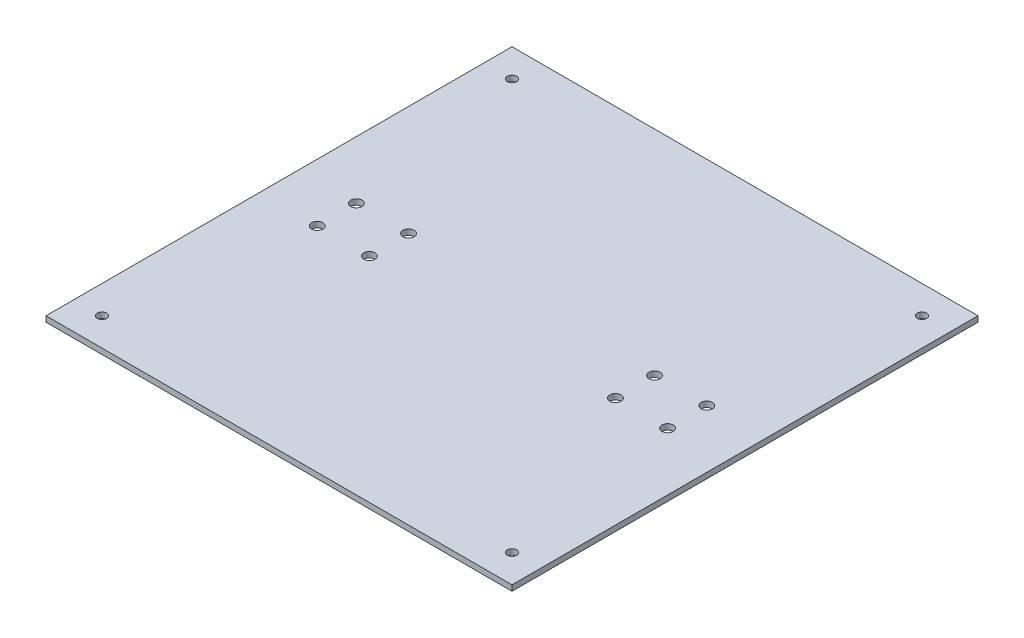
ISO-10303-21;
HEADER;
FILE_DESCRIPTION(('STEP AP214'),'2;1');
FILE_NAME('part.step','',(''),(''),'','','');
FILE_SCHEMA(('AUTOMOTIVE_DESIGN { 1 0 10303 214 1 1 1 1 }'));
ENDSEC;
DATA;
#1=APPLICATION_CONTEXT('core data for automotive mechanical design processes');
#2=APPLICATION_PROTOCOL_DEFINITION('international standard','automotive_design',2000,#1);
#3=PRODUCT_CONTEXT('',#1,'mechanical');
#4=PRODUCT('Part','Part','',(#3));
#5=PRODUCT_RELATED_PRODUCT_CATEGORY('part','',(#4));
#6=PRODUCT_DEFINITION_FORMATION('','',#4);
#7=PRODUCT_DEFINITION_CONTEXT('part definition',#1,'design');
#8=PRODUCT_DEFINITION('design','',#6,#7);
#9=PRODUCT_DEFINITION_SHAPE('','',#8);
#10=(LENGTH_UNIT() NAMED_UNIT(*) SI_UNIT(.MILLI.,.METRE.));
#11=(NAMED_UNIT(*) PLANE_ANGLE_UNIT() SI_UNIT($,.RADIAN.));
#12=(NAMED_UNIT(*) SI_UNIT($,.STERADIAN.) SOLID_ANGLE_UNIT());
#13=UNCERTAINTY_MEASURE_WITH_UNIT(LENGTH_MEASURE(1.E-05),#10,'distance_accuracy_value','');
#14=(GEOMETRIC_REPRESENTATION_CONTEXT(3) GLOBAL_UNCERTAINTY_ASSIGNED_CONTEXT((#13)) GLOBAL_UNIT_ASSIGNED_CONTEXT((#10,
#11,#12)) REPRESENTATION_CONTEXT('',''));
#15=CARTESIAN_POINT('',(0.,0.,0.));
#16=DIRECTION('',(0.,0.,1.));
#17=DIRECTION('',(1.,0.,0.));
#18=AXIS2_PLACEMENT_3D('',#15,#16,#17);
#19=CARTESIAN_POINT('',(0.,3.,0.));
#20=DIRECTION('',(1.,0.,0.));
#21=DIRECTION('',(0.,0.,-1.));
#22=AXIS2_PLACEMENT_3D('',#19,#20,#21);
#23=PLANE('',#22);
#24=DIRECTION('',(0.,0.,1.));
#25=VECTOR('',#24,1.);
#26=CARTESIAN_POINT('',(0.,0.,0.));
#27=LINE('',#26,#25);
#28=CARTESIAN_POINT('',(0.,0.,-250.));
#29=VERTEX_POINT('',#28);
#30=CARTESIAN_POINT('',(0.,0.,0.));
#31=VERTEX_POINT('',#30);
#32=EDGE_CURVE('E96',#29,#31,#27,.T.);
#33=ORIENTED_EDGE('',*,*,#32,.T.);
#34=DIRECTION('',(0.,-1.,0.));
#35=VECTOR('',#34,1.);
#36=CARTESIAN_POINT('',(0.,3.,0.));
#37=LINE('',#36,#35);
#38=CARTESIAN_POINT('',(0.,3.,0.));
#39=VERTEX_POINT('',#38);
#40=EDGE_CURVE('E11',#39,#31,#37,.T.);
#41=ORIENTED_EDGE('',*,*,#40,.F.);
#42=DIRECTION('',(0.,0.,1.));
#43=VECTOR('',#42,1.);
#44=CARTESIAN_POINT('',(0.,3.,0.));
#45=LINE('',#44,#43);
#46=CARTESIAN_POINT('',(0.,3.,-250.));
#47=VERTEX_POINT('',#46);
#48=EDGE_CURVE('E84',#47,#39,#45,.T.);
#49=ORIENTED_EDGE('',*,*,#48,.F.);
#50=DIRECTION('',(0.,-1.,0.));
#51=VECTOR('',#50,1.);
#52=CARTESIAN_POINT('',(0.,3.,-250.));
#53=LINE('',#52,#51);
#54=EDGE_CURVE('E92',#47,#29,#53,.T.);
#55=ORIENTED_EDGE('',*,*,#54,.T.);
#56=EDGE_LOOP('',(#33,#41,#49,#55));
#57=FACE_BOUND('',#56,.T.);
#58=ADVANCED_FACE('F33',(#57),#23,.F.);
#59=CARTESIAN_POINT('',(0.,3.,0.));
#60=DIRECTION('',(0.,0.,-1.));
#61=DIRECTION('',(-1.,0.,0.));
#62=AXIS2_PLACEMENT_3D('',#59,#60,#61);
#63=PLANE('',#62);
#64=DIRECTION('',(1.,0.,0.));
#65=VECTOR('',#64,1.);
#66=CARTESIAN_POINT('',(0.,0.,0.));
#67=LINE('',#66,#65);
#68=CARTESIAN_POINT('',(250.,0.,0.));
#69=VERTEX_POINT('',#68);
#70=EDGE_CURVE('E88',#31,#69,#67,.T.);
#71=ORIENTED_EDGE('',*,*,#70,.T.);
#72=DIRECTION('',(0.,-1.,0.));
#73=VECTOR('',#72,1.);
#74=CARTESIAN_POINT('',(250.,3.,0.));
#75=LINE('',#74,#73);
#76=CARTESIAN_POINT('',(250.,3.,0.));
#77=VERTEX_POINT('',#76);
#78=EDGE_CURVE('E41',#77,#69,#75,.T.);
#79=ORIENTED_EDGE('',*,*,#78,.F.);
#80=DIRECTION('',(1.,0.,0.));
#81=VECTOR('',#80,1.);
#82=CARTESIAN_POINT('',(0.,3.,0.));
#83=LINE('',#82,#81);
#84=EDGE_CURVE('E79',#39,#77,#83,.T.);
#85=ORIENTED_EDGE('',*,*,#84,.F.);
#86=ORIENTED_EDGE('',*,*,#40,.T.);
#87=EDGE_LOOP('',(#71,#79,#85,#86));
#88=FACE_BOUND('',#87,.T.);
#89=ADVANCED_FACE('F87',(#88),#63,.F.);
#90=CARTESIAN_POINT('',(250.,3.,0.));
#91=DIRECTION('',(-1.,0.,0.));
#92=DIRECTION('',(0.,0.,1.));
#93=AXIS2_PLACEMENT_3D('',#90,#91,#92);
#94=PLANE('',#93);
#95=DIRECTION('',(0.,0.,-1.));
#96=VECTOR('',#95,1.);
#97=CARTESIAN_POINT('',(250.,0.,0.));
#98=LINE('',#97,#96);
#99=CARTESIAN_POINT('',(250.,0.,-250.));
#100=VERTEX_POINT('',#99);
#101=EDGE_CURVE('E66',#69,#100,#98,.T.);
#102=ORIENTED_EDGE('',*,*,#101,.T.);
#103=DIRECTION('',(0.,-1.,0.));
#104=VECTOR('',#103,1.);
#105=CARTESIAN_POINT('',(250.,3.,-250.));
#106=LINE('',#105,#104);
#107=CARTESIAN_POINT('',(250.,3.,-250.));
#108=VERTEX_POINT('',#107);
#109=EDGE_CURVE('E89',#108,#100,#106,.T.);
#110=ORIENTED_EDGE('',*,*,#109,.F.);
#111=DIRECTION('',(0.,0.,-1.));
#112=VECTOR('',#111,1.);
#113=CARTESIAN_POINT('',(250.,3.,0.));
#114=LINE('',#113,#112);
#115=EDGE_CURVE('E82',#77,#108,#114,.T.);
#116=ORIENTED_EDGE('',*,*,#115,.F.);
#117=ORIENTED_EDGE('',*,*,#78,.T.);
#118=EDGE_LOOP('',(#102,#110,#116,#117));
#119=FACE_BOUND('',#118,.T.);
#120=ADVANCED_FACE('F90',(#119),#94,.F.);
#121=CARTESIAN_POINT('',(0.,3.,-250.));
#122=DIRECTION('',(0.,0.,1.));
#123=DIRECTION('',(1.,0.,0.));
#124=AXIS2_PLACEMENT_3D('',#121,#122,#123);
#125=PLANE('',#124);
#126=DIRECTION('',(-1.,0.,0.));
#127=VECTOR('',#126,1.);
#128=CARTESIAN_POINT('',(0.,0.,-250.));
#129=LINE('',#128,#127);
#130=EDGE_CURVE('E72',#100,#29,#129,.T.);
#131=ORIENTED_EDGE('',*,*,#130,.T.);
#132=ORIENTED_EDGE('',*,*,#54,.F.);
#133=DIRECTION('',(-1.,0.,0.));
#134=VECTOR('',#133,1.);
#135=CARTESIAN_POINT('',(0.,3.,-250.));
#136=LINE('',#135,#134);
#137=EDGE_CURVE('E49',#108,#47,#136,.T.);
#138=ORIENTED_EDGE('',*,*,#137,.F.);
#139=ORIENTED_EDGE('',*,*,#109,.T.);
#140=EDGE_LOOP('',(#131,#132,#138,#139));
#141=FACE_BOUND('',#140,.T.);
#142=ADVANCED_FACE('F104',(#141),#125,.F.);
#143=CARTESIAN_POINT('',(0.,3.,0.));
#144=DIRECTION('',(0.,-1.,0.));
#145=DIRECTION('',(0.,0.,-1.));
#146=AXIS2_PLACEMENT_3D('',#143,#144,#145);
#147=PLANE('',#146);
#148=CARTESIAN_POINT('',(191.,3.,-114.5));
#149=DIRECTION('',(0.,1.,0.));
#150=DIRECTION('',(0.,0.,1.));
#151=AXIS2_PLACEMENT_3D('',#148,#149,#150);
#152=CIRCLE('',#151,2.99999999999999);
#153=CARTESIAN_POINT('',(191.,3.,-111.5));
#154=VERTEX_POINT('',#153);
#155=EDGE_CURVE('E176',#154,#154,#152,.T.);
#156=ORIENTED_EDGE('',*,*,#155,.F.);
#157=EDGE_LOOP('',(#156));
#158=FACE_BOUND('',#157,.T.);
#159=CARTESIAN_POINT('',(219.,3.,-114.5));
#160=DIRECTION('',(0.,1.,0.));
#161=DIRECTION('',(0.,0.,1.));
#162=AXIS2_PLACEMENT_3D('',#159,#160,#161);
#163=CIRCLE('',#162,2.99999999999999);
#164=CARTESIAN_POINT('',(219.,3.,-111.5));
#165=VERTEX_POINT('',#164);
#166=EDGE_CURVE('E170',#165,#165,#163,.T.);
#167=ORIENTED_EDGE('',*,*,#166,.F.);
#168=EDGE_LOOP('',(#167));
#169=FACE_BOUND('',#168,.T.);
#170=CARTESIAN_POINT('',(219.,3.,-135.5));
#171=DIRECTION('',(0.,1.,0.));
#172=DIRECTION('',(0.,0.,1.));
#173=AXIS2_PLACEMENT_3D('',#170,#171,#172);
#174=CIRCLE('',#173,2.99999999999999);
#175=CARTESIAN_POINT('',(219.,3.,-132.5));
#176=VERTEX_POINT('',#175);
#177=EDGE_CURVE('E164',#176,#176,#174,.T.);
#178=ORIENTED_EDGE('',*,*,#177,.F.);
#179=EDGE_LOOP('',(#178));
#180=FACE_BOUND('',#179,.T.);
#181=CARTESIAN_POINT('',(191.,3.,-135.5));
#182=DIRECTION('',(0.,1.,0.));
#183=DIRECTION('',(0.,0.,1.));
#184=AXIS2_PLACEMENT_3D('',#181,#182,#183);
#185=CIRCLE('',#184,2.99999999999999);
#186=CARTESIAN_POINT('',(191.,3.,-132.5));
#187=VERTEX_POINT('',#186);
#188=EDGE_CURVE('E158',#187,#187,#185,.T.);
#189=ORIENTED_EDGE('',*,*,#188,.F.);
#190=EDGE_LOOP('',(#189));
#191=FACE_BOUND('',#190,.T.);
#192=CARTESIAN_POINT('',(31.,3.,-114.5));
#193=DIRECTION('',(0.,1.,0.));
#194=DIRECTION('',(0.,0.,1.));
#195=AXIS2_PLACEMENT_3D('',#192,#193,#194);
#196=CIRCLE('',#195,3.);
#197=CARTESIAN_POINT('',(31.,3.,-111.5));
#198=VERTEX_POINT('',#197);
#199=EDGE_CURVE('E152',#198,#198,#196,.T.);
#200=ORIENTED_EDGE('',*,*,#199,.F.);
#201=EDGE_LOOP('',(#200));
#202=FACE_BOUND('',#201,.T.);
#203=CARTESIAN_POINT('',(59.,3.,-114.5));
#204=DIRECTION('',(0.,1.,0.));
#205=DIRECTION('',(0.,0.,1.));
#206=AXIS2_PLACEMENT_3D('',#203,#204,#205);
#207=CIRCLE('',#206,3.);
#208=CARTESIAN_POINT('',(59.,3.,-111.5));
#209=VERTEX_POINT('',#208);
#210=EDGE_CURVE('E146',#209,#209,#207,.T.);
#211=ORIENTED_EDGE('',*,*,#210,.F.);
#212=EDGE_LOOP('',(#211));
#213=FACE_BOUND('',#212,.T.);
#214=CARTESIAN_POINT('',(59.,3.,-135.5));
#215=DIRECTION('',(0.,1.,0.));
#216=DIRECTION('',(0.,0.,1.));
#217=AXIS2_PLACEMENT_3D('',#214,#215,#216);
#218=CIRCLE('',#217,3.);
#219=CARTESIAN_POINT('',(59.,3.,-132.5));
#220=VERTEX_POINT('',#219);
#221=EDGE_CURVE('E140',#220,#220,#218,.T.);
#222=ORIENTED_EDGE('',*,*,#221,.F.);
#223=EDGE_LOOP('',(#222));
#224=FACE_BOUND('',#223,.T.);
#225=CARTESIAN_POINT('',(31.,3.,-135.5));
#226=DIRECTION('',(0.,1.,0.));
#227=DIRECTION('',(0.,0.,1.));
#228=AXIS2_PLACEMENT_3D('',#225,#226,#227);
#229=CIRCLE('',#228,3.);
#230=CARTESIAN_POINT('',(31.,3.,-132.5));
#231=VERTEX_POINT('',#230);
#232=EDGE_CURVE('E134',#231,#231,#229,.T.);
#233=ORIENTED_EDGE('',*,*,#232,.F.);
#234=EDGE_LOOP('',(#233));
#235=FACE_BOUND('',#234,.T.);
#236=CARTESIAN_POINT('',(15.,3.,-15.));
#237=DIRECTION('',(0.,1.,0.));
#238=DIRECTION('',(0.,0.,1.));
#239=AXIS2_PLACEMENT_3D('',#236,#237,#238);
#240=CIRCLE('',#239,2.5);
#241=CARTESIAN_POINT('',(15.,3.,-12.5));
#242=VERTEX_POINT('',#241);
#243=EDGE_CURVE('E128',#242,#242,#240,.T.);
#244=ORIENTED_EDGE('',*,*,#243,.F.);
#245=EDGE_LOOP('',(#244));
#246=FACE_BOUND('',#245,.T.);
#247=CARTESIAN_POINT('',(235.,3.,-15.));
#248=DIRECTION('',(0.,1.,0.));
#249=DIRECTION('',(0.,0.,1.));
#250=AXIS2_PLACEMENT_3D('',#247,#248,#249);
#251=CIRCLE('',#250,2.5);
#252=CARTESIAN_POINT('',(235.,3.,-12.5));
#253=VERTEX_POINT('',#252);
#254=EDGE_CURVE('E122',#253,#253,#251,.T.);
#255=ORIENTED_EDGE('',*,*,#254,.F.);
#256=EDGE_LOOP('',(#255));
#257=FACE_BOUND('',#256,.T.);
#258=CARTESIAN_POINT('',(235.,3.,-235.));
#259=DIRECTION('',(0.,1.,0.));
#260=DIRECTION('',(0.,0.,1.));
#261=AXIS2_PLACEMENT_3D('',#258,#259,#260);
#262=CIRCLE('',#261,2.5);
#263=CARTESIAN_POINT('',(235.,3.,-232.5));
#264=VERTEX_POINT('',#263);
#265=EDGE_CURVE('E116',#264,#264,#262,.T.);
#266=ORIENTED_EDGE('',*,*,#265,.F.);
#267=EDGE_LOOP('',(#266));
#268=FACE_BOUND('',#267,.T.);
#269=CARTESIAN_POINT('',(15.,3.,-235.));
#270=DIRECTION('',(0.,1.,0.));
#271=DIRECTION('',(0.,0.,1.));
#272=AXIS2_PLACEMENT_3D('',#269,#270,#271);
#273=CIRCLE('',#272,2.5);
#274=CARTESIAN_POINT('',(15.,3.,-232.5));
#275=VERTEX_POINT('',#274);
#276=EDGE_CURVE('E110',#275,#275,#273,.T.);
#277=ORIENTED_EDGE('',*,*,#276,.F.);
#278=EDGE_LOOP('',(#277));
#279=FACE_BOUND('',#278,.T.);
#280=ORIENTED_EDGE('',*,*,#48,.T.);
#281=ORIENTED_EDGE('',*,*,#84,.T.);
#282=ORIENTED_EDGE('',*,*,#115,.T.);
#283=ORIENTED_EDGE('',*,*,#137,.T.);
#284=EDGE_LOOP('',(#280,#281,#282,#283));
#285=FACE_BOUND('',#284,.T.);
#286=ADVANCED_FACE('F80',(#158,#169,#180,#191,#202,#213,#224,#235,#246,#257,#268,#279,#285),
#147,.F.);
#287=CARTESIAN_POINT('',(0.,0.,0.));
#288=DIRECTION('',(0.,-1.,0.));
#289=DIRECTION('',(0.,0.,-1.));
#290=AXIS2_PLACEMENT_3D('',#287,#288,#289);
#291=PLANE('',#290);
#292=CARTESIAN_POINT('',(191.,0.,-114.5));
#293=DIRECTION('',(0.,1.,0.));
#294=DIRECTION('',(0.,0.,1.));
#295=AXIS2_PLACEMENT_3D('',#292,#293,#294);
#296=CIRCLE('',#295,2.99999999999999);
#297=CARTESIAN_POINT('',(191.,0.,-111.5));
#298=VERTEX_POINT('',#297);
#299=EDGE_CURVE('E173',#298,#298,#296,.T.);
#300=ORIENTED_EDGE('',*,*,#299,.T.);
#301=EDGE_LOOP('',(#300));
#302=FACE_BOUND('',#301,.T.);
#303=CARTESIAN_POINT('',(219.,0.,-114.5));
#304=DIRECTION('',(0.,1.,0.));
#305=DIRECTION('',(0.,0.,1.));
#306=AXIS2_PLACEMENT_3D('',#303,#304,#305);
#307=CIRCLE('',#306,2.99999999999999);
#308=CARTESIAN_POINT('',(219.,0.,-111.5));
#309=VERTEX_POINT('',#308);
#310=EDGE_CURVE('E167',#309,#309,#307,.T.);
#311=ORIENTED_EDGE('',*,*,#310,.T.);
#312=EDGE_LOOP('',(#311));
#313=FACE_BOUND('',#312,.T.);
#314=CARTESIAN_POINT('',(219.,0.,-135.5));
#315=DIRECTION('',(0.,1.,0.));
#316=DIRECTION('',(0.,0.,1.));
#317=AXIS2_PLACEMENT_3D('',#314,#315,#316);
#318=CIRCLE('',#317,2.99999999999999);
#319=CARTESIAN_POINT('',(219.,0.,-132.5));
#320=VERTEX_POINT('',#319);
#321=EDGE_CURVE('E161',#320,#320,#318,.T.);
#322=ORIENTED_EDGE('',*,*,#321,.T.);
#323=EDGE_LOOP('',(#322));
#324=FACE_BOUND('',#323,.T.);
#325=CARTESIAN_POINT('',(191.,0.,-135.5));
#326=DIRECTION('',(0.,1.,0.));
#327=DIRECTION('',(0.,0.,1.));
#328=AXIS2_PLACEMENT_3D('',#325,#326,#327);
#329=CIRCLE('',#328,2.99999999999999);
#330=CARTESIAN_POINT('',(191.,0.,-132.5));
#331=VERTEX_POINT('',#330);
#332=EDGE_CURVE('E155',#331,#331,#329,.T.);
#333=ORIENTED_EDGE('',*,*,#332,.T.);
#334=EDGE_LOOP('',(#333));
#335=FACE_BOUND('',#334,.T.);
#336=CARTESIAN_POINT('',(31.,0.,-114.5));
#337=DIRECTION('',(0.,1.,0.));
#338=DIRECTION('',(0.,0.,1.));
#339=AXIS2_PLACEMENT_3D('',#336,#337,#338);
#340=CIRCLE('',#339,3.);
#341=CARTESIAN_POINT('',(31.,0.,-111.5));
#342=VERTEX_POINT('',#341);
#343=EDGE_CURVE('E149',#342,#342,#340,.T.);
#344=ORIENTED_EDGE('',*,*,#343,.T.);
#345=EDGE_LOOP('',(#344));
#346=FACE_BOUND('',#345,.T.);
#347=CARTESIAN_POINT('',(59.,0.,-114.5));
#348=DIRECTION('',(0.,1.,0.));
#349=DIRECTION('',(0.,0.,1.));
#350=AXIS2_PLACEMENT_3D('',#347,#348,#349);
#351=CIRCLE('',#350,3.);
#352=CARTESIAN_POINT('',(59.,0.,-111.5));
#353=VERTEX_POINT('',#352);
#354=EDGE_CURVE('E143',#353,#353,#351,.T.);
#355=ORIENTED_EDGE('',*,*,#354,.T.);
#356=EDGE_LOOP('',(#355));
#357=FACE_BOUND('',#356,.T.);
#358=CARTESIAN_POINT('',(59.,0.,-135.5));
#359=DIRECTION('',(0.,1.,0.));
#360=DIRECTION('',(0.,0.,1.));
#361=AXIS2_PLACEMENT_3D('',#358,#359,#360);
#362=CIRCLE('',#361,3.);
#363=CARTESIAN_POINT('',(59.,0.,-132.5));
#364=VERTEX_POINT('',#363);
#365=EDGE_CURVE('E137',#364,#364,#362,.T.);
#366=ORIENTED_EDGE('',*,*,#365,.T.);
#367=EDGE_LOOP('',(#366));
#368=FACE_BOUND('',#367,.T.);
#369=CARTESIAN_POINT('',(31.,0.,-135.5));
#370=DIRECTION('',(0.,1.,0.));
#371=DIRECTION('',(0.,0.,1.));
#372=AXIS2_PLACEMENT_3D('',#369,#370,#371);
#373=CIRCLE('',#372,3.);
#374=CARTESIAN_POINT('',(31.,0.,-132.5));
#375=VERTEX_POINT('',#374);
#376=EDGE_CURVE('E131',#375,#375,#373,.T.);
#377=ORIENTED_EDGE('',*,*,#376,.T.);
#378=EDGE_LOOP('',(#377));
#379=FACE_BOUND('',#378,.T.);
#380=CARTESIAN_POINT('',(15.,0.,-15.));
#381=DIRECTION('',(0.,1.,0.));
#382=DIRECTION('',(0.,0.,1.));
#383=AXIS2_PLACEMENT_3D('',#380,#381,#382);
#384=CIRCLE('',#383,2.5);
#385=CARTESIAN_POINT('',(15.,0.,-12.5));
#386=VERTEX_POINT('',#385);
#387=EDGE_CURVE('E125',#386,#386,#384,.T.);
#388=ORIENTED_EDGE('',*,*,#387,.T.);
#389=EDGE_LOOP('',(#388));
#390=FACE_BOUND('',#389,.T.);
#391=CARTESIAN_POINT('',(235.,0.,-15.));
#392=DIRECTION('',(0.,1.,0.));
#393=DIRECTION('',(0.,0.,1.));
#394=AXIS2_PLACEMENT_3D('',#391,#392,#393);
#395=CIRCLE('',#394,2.5);
#396=CARTESIAN_POINT('',(235.,0.,-12.5));
#397=VERTEX_POINT('',#396);
#398=EDGE_CURVE('E119',#397,#397,#395,.T.);
#399=ORIENTED_EDGE('',*,*,#398,.T.);
#400=EDGE_LOOP('',(#399));
#401=FACE_BOUND('',#400,.T.);
#402=CARTESIAN_POINT('',(235.,0.,-235.));
#403=DIRECTION('',(0.,1.,0.));
#404=DIRECTION('',(0.,0.,1.));
#405=AXIS2_PLACEMENT_3D('',#402,#403,#404);
#406=CIRCLE('',#405,2.5);
#407=CARTESIAN_POINT('',(235.,0.,-232.5));
#408=VERTEX_POINT('',#407);
#409=EDGE_CURVE('E113',#408,#408,#406,.T.);
#410=ORIENTED_EDGE('',*,*,#409,.T.);
#411=EDGE_LOOP('',(#410));
#412=FACE_BOUND('',#411,.T.);
#413=CARTESIAN_POINT('',(15.,0.,-235.));
#414=DIRECTION('',(0.,1.,0.));
#415=DIRECTION('',(0.,0.,1.));
#416=AXIS2_PLACEMENT_3D('',#413,#414,#415);
#417=CIRCLE('',#416,2.5);
#418=CARTESIAN_POINT('',(15.,0.,-232.5));
#419=VERTEX_POINT('',#418);
#420=EDGE_CURVE('E99',#419,#419,#417,.T.);
#421=ORIENTED_EDGE('',*,*,#420,.T.);
#422=EDGE_LOOP('',(#421));
#423=FACE_BOUND('',#422,.T.);
#424=ORIENTED_EDGE('',*,*,#32,.F.);
#425=ORIENTED_EDGE('',*,*,#130,.F.);
#426=ORIENTED_EDGE('',*,*,#101,.F.);
#427=ORIENTED_EDGE('',*,*,#70,.F.);
#428=EDGE_LOOP('',(#424,#425,#426,#427));
#429=FACE_BOUND('',#428,.T.);
#430=ADVANCED_FACE('F107',(#302,#313,#324,#335,#346,#357,#368,#379,#390,#401,#412,#423,#429),
#291,.T.);
#431=CARTESIAN_POINT('',(15.,0.,-235.));
#432=DIRECTION('',(0.,1.,0.));
#433=DIRECTION('',(0.,0.,1.));
#434=AXIS2_PLACEMENT_3D('',#431,#432,#433);
#435=CYLINDRICAL_SURFACE('',#434,2.5);
#436=ORIENTED_EDGE('',*,*,#420,.F.);
#437=EDGE_LOOP('',(#436));
#438=FACE_BOUND('',#437,.T.);
#439=ORIENTED_EDGE('',*,*,#276,.T.);
#440=EDGE_LOOP('',(#439));
#441=FACE_BOUND('',#440,.T.);
#442=ADVANCED_FACE('F216',(#438,#441),#435,.F.);
#443=CARTESIAN_POINT('',(235.,0.,-235.));
#444=DIRECTION('',(0.,1.,0.));
#445=DIRECTION('',(0.,0.,1.));
#446=AXIS2_PLACEMENT_3D('',#443,#444,#445);
#447=CYLINDRICAL_SURFACE('',#446,2.5);
#448=ORIENTED_EDGE('',*,*,#409,.F.);
#449=EDGE_LOOP('',(#448));
#450=FACE_BOUND('',#449,.T.);
#451=ORIENTED_EDGE('',*,*,#265,.T.);
#452=EDGE_LOOP('',(#451));
#453=FACE_BOUND('',#452,.T.);
#454=ADVANCED_FACE('F218',(#450,#453),#447,.F.);
#455=CARTESIAN_POINT('',(235.,0.,-15.));
#456=DIRECTION('',(0.,1.,0.));
#457=DIRECTION('',(0.,0.,1.));
#458=AXIS2_PLACEMENT_3D('',#455,#456,#457);
#459=CYLINDRICAL_SURFACE('',#458,2.5);
#460=ORIENTED_EDGE('',*,*,#398,.F.);
#461=EDGE_LOOP('',(#460));
#462=FACE_BOUND('',#461,.T.);
#463=ORIENTED_EDGE('',*,*,#254,.T.);
#464=EDGE_LOOP('',(#463));
#465=FACE_BOUND('',#464,.T.);
#466=ADVANCED_FACE('F225',(#462,#465),#459,.F.);
#467=CARTESIAN_POINT('',(15.,0.,-15.));
#468=DIRECTION('',(0.,1.,0.));
#469=DIRECTION('',(0.,0.,1.));
#470=AXIS2_PLACEMENT_3D('',#467,#468,#469);
#471=CYLINDRICAL_SURFACE('',#470,2.5);
#472=ORIENTED_EDGE('',*,*,#387,.F.);
#473=EDGE_LOOP('',(#472));
#474=FACE_BOUND('',#473,.T.);
#475=ORIENTED_EDGE('',*,*,#243,.T.);
#476=EDGE_LOOP('',(#475));
#477=FACE_BOUND('',#476,.T.);
#478=ADVANCED_FACE('F271',(#474,#477),#471,.F.);
#479=CARTESIAN_POINT('',(31.,0.,-135.5));
#480=DIRECTION('',(0.,1.,0.));
#481=DIRECTION('',(0.,0.,1.));
#482=AXIS2_PLACEMENT_3D('',#479,#480,#481);
#483=CYLINDRICAL_SURFACE('',#482,3.);
#484=ORIENTED_EDGE('',*,*,#376,.F.);
#485=EDGE_LOOP('',(#484));
#486=FACE_BOUND('',#485,.T.);
#487=ORIENTED_EDGE('',*,*,#232,.T.);
#488=EDGE_LOOP('',(#487));
#489=FACE_BOUND('',#488,.T.);
#490=ADVANCED_FACE('F281',(#486,#489),#483,.F.);
#491=CARTESIAN_POINT('',(59.,0.,-135.5));
#492=DIRECTION('',(0.,1.,0.));
#493=DIRECTION('',(0.,0.,1.));
#494=AXIS2_PLACEMENT_3D('',#491,#492,#493);
#495=CYLINDRICAL_SURFACE('',#494,3.);
#496=ORIENTED_EDGE('',*,*,#365,.F.);
#497=EDGE_LOOP('',(#496));
#498=FACE_BOUND('',#497,.T.);
#499=ORIENTED_EDGE('',*,*,#221,.T.);
#500=EDGE_LOOP('',(#499));
#501=FACE_BOUND('',#500,.T.);
#502=ADVANCED_FACE('F291',(#498,#501),#495,.F.);
#503=CARTESIAN_POINT('',(59.,0.,-114.5));
#504=DIRECTION('',(0.,1.,0.));
#505=DIRECTION('',(0.,0.,1.));
#506=AXIS2_PLACEMENT_3D('',#503,#504,#505);
#507=CYLINDRICAL_SURFACE('',#506,3.);
#508=ORIENTED_EDGE('',*,*,#354,.F.);
#509=EDGE_LOOP('',(#508));
#510=FACE_BOUND('',#509,.T.);
#511=ORIENTED_EDGE('',*,*,#210,.T.);
#512=EDGE_LOOP('',(#511));
#513=FACE_BOUND('',#512,.T.);
#514=ADVANCED_FACE('F301',(#510,#513),#507,.F.);
#515=CARTESIAN_POINT('',(31.,0.,-114.5));
#516=DIRECTION('',(0.,1.,0.));
#517=DIRECTION('',(0.,0.,1.));
#518=AXIS2_PLACEMENT_3D('',#515,#516,#517);
#519=CYLINDRICAL_SURFACE('',#518,3.);
#520=ORIENTED_EDGE('',*,*,#343,.F.);
#521=EDGE_LOOP('',(#520));
#522=FACE_BOUND('',#521,.T.);
#523=ORIENTED_EDGE('',*,*,#199,.T.);
#524=EDGE_LOOP('',(#523));
#525=FACE_BOUND('',#524,.T.);
#526=ADVANCED_FACE('F311',(#522,#525),#519,.F.);
#527=CARTESIAN_POINT('',(191.,0.,-135.5));
#528=DIRECTION('',(0.,1.,0.));
#529=DIRECTION('',(0.,0.,1.));
#530=AXIS2_PLACEMENT_3D('',#527,#528,#529);
#531=CYLINDRICAL_SURFACE('',#530,2.99999999999999);
#532=ORIENTED_EDGE('',*,*,#332,.F.);
#533=EDGE_LOOP('',(#532));
#534=FACE_BOUND('',#533,.T.);
#535=ORIENTED_EDGE('',*,*,#188,.T.);
#536=EDGE_LOOP('',(#535));
#537=FACE_BOUND('',#536,.T.);
#538=ADVANCED_FACE('F321',(#534,#537),#531,.F.);
#539=CARTESIAN_POINT('',(219.,0.,-135.5));
#540=DIRECTION('',(0.,1.,0.));
#541=DIRECTION('',(0.,0.,1.));
#542=AXIS2_PLACEMENT_3D('',#539,#540,#541);
#543=CYLINDRICAL_SURFACE('',#542,2.99999999999999);
#544=ORIENTED_EDGE('',*,*,#321,.F.);
#545=EDGE_LOOP('',(#544));
#546=FACE_BOUND('',#545,.T.);
#547=ORIENTED_EDGE('',*,*,#177,.T.);
#548=EDGE_LOOP('',(#547));
#549=FACE_BOUND('',#548,.T.);
#550=ADVANCED_FACE('F331',(#546,#549),#543,.F.);
#551=CARTESIAN_POINT('',(219.,0.,-114.5));
#552=DIRECTION('',(0.,1.,0.));
#553=DIRECTION('',(0.,0.,1.));
#554=AXIS2_PLACEMENT_3D('',#551,#552,#553);
#555=CYLINDRICAL_SURFACE('',#554,2.99999999999999);
#556=ORIENTED_EDGE('',*,*,#310,.F.);
#557=EDGE_LOOP('',(#556));
#558=FACE_BOUND('',#557,.T.);
#559=ORIENTED_EDGE('',*,*,#166,.T.);
#560=EDGE_LOOP('',(#559));
#561=FACE_BOUND('',#560,.T.);
#562=ADVANCED_FACE('F187',(#558,#561),#555,.F.);
#563=CARTESIAN_POINT('',(191.,0.,-114.5));
#564=DIRECTION('',(0.,1.,0.));
#565=DIRECTION('',(0.,0.,1.));
#566=AXIS2_PLACEMENT_3D('',#563,#564,#565);
#567=CYLINDRICAL_SURFACE('',#566,2.99999999999999);
#568=ORIENTED_EDGE('',*,*,#299,.F.);
#569=EDGE_LOOP('',(#568));
#570=FACE_BOUND('',#569,.T.);
#571=ORIENTED_EDGE('',*,*,#155,.T.);
#572=EDGE_LOOP('',(#571));
#573=FACE_BOUND('',#572,.T.);
#574=ADVANCED_FACE('F184',(#570,#573),#567,.F.);
#575=CLOSED_SHELL('',(#58,#89,#120,#142,#286,#430,#442,#454,#466,#478,#490,#502,#514,#526,#538,
#550,#562,#574));
#576=MANIFOLD_SOLID_BREP('B2',#575);
#577=ADVANCED_BREP_SHAPE_REPRESENTATION('',(#18,#576),#14);
#578=SHAPE_DEFINITION_REPRESENTATION(#9,#577);
ENDSEC;
END-ISO-10303-21;
